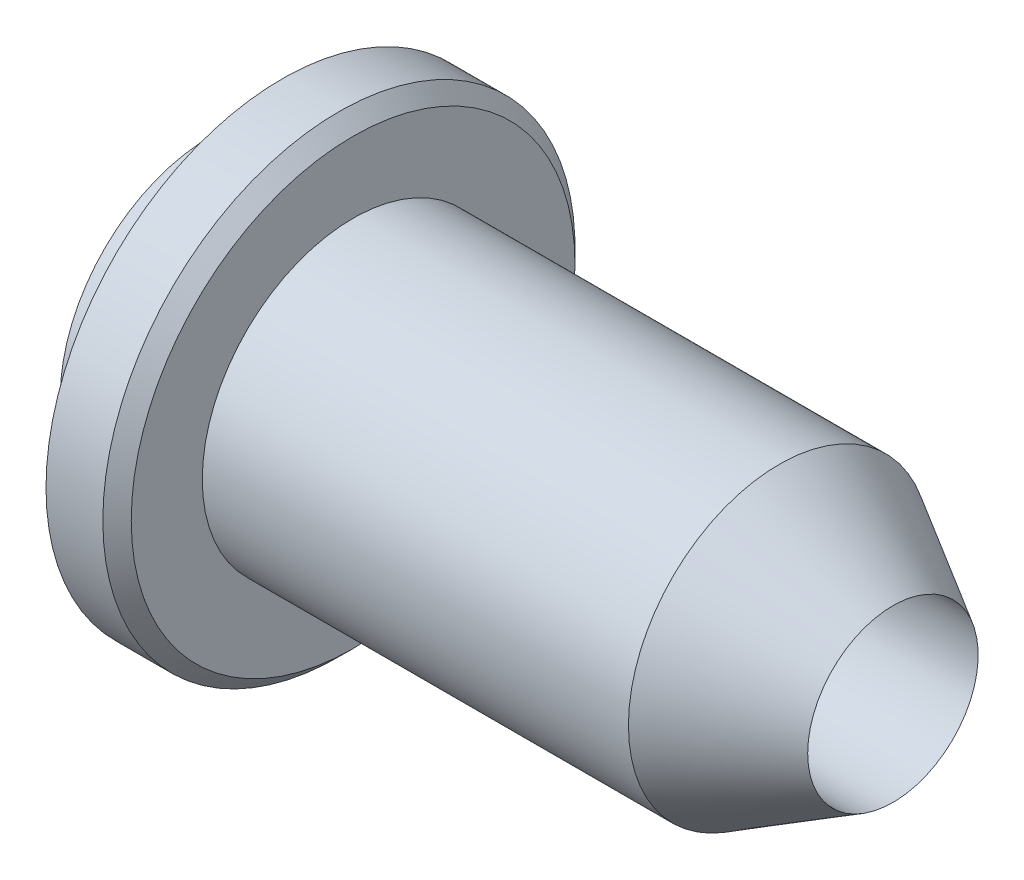
ISO-10303-21;
HEADER;
FILE_DESCRIPTION(('STEP AP214'),'2;1');
FILE_NAME('part.step','',(''),(''),'','','');
FILE_SCHEMA(('AUTOMOTIVE_DESIGN { 1 0 10303 214 1 1 1 1 }'));
ENDSEC;
DATA;
#1=APPLICATION_CONTEXT('core data for automotive mechanical design processes');
#2=APPLICATION_PROTOCOL_DEFINITION('international standard','automotive_design',2000,#1);
#3=PRODUCT_CONTEXT('',#1,'mechanical');
#4=PRODUCT('Part','Part','',(#3));
#5=PRODUCT_RELATED_PRODUCT_CATEGORY('part','',(#4));
#6=PRODUCT_DEFINITION_FORMATION('','',#4);
#7=PRODUCT_DEFINITION_CONTEXT('part definition',#1,'design');
#8=PRODUCT_DEFINITION('design','',#6,#7);
#9=PRODUCT_DEFINITION_SHAPE('','',#8);
#10=(LENGTH_UNIT() NAMED_UNIT(*) SI_UNIT(.MILLI.,.METRE.));
#11=(NAMED_UNIT(*) PLANE_ANGLE_UNIT() SI_UNIT($,.RADIAN.));
#12=(NAMED_UNIT(*) SI_UNIT($,.STERADIAN.) SOLID_ANGLE_UNIT());
#13=UNCERTAINTY_MEASURE_WITH_UNIT(LENGTH_MEASURE(1.E-05),#10,'distance_accuracy_value','');
#14=(GEOMETRIC_REPRESENTATION_CONTEXT(3) GLOBAL_UNCERTAINTY_ASSIGNED_CONTEXT((#13)) GLOBAL_UNIT_ASSIGNED_CONTEXT((#10,
#11,#12)) REPRESENTATION_CONTEXT('',''));
#15=CARTESIAN_POINT('',(0.,0.,0.));
#16=DIRECTION('',(0.,0.,1.));
#17=DIRECTION('',(1.,0.,0.));
#18=AXIS2_PLACEMENT_3D('',#15,#16,#17);
#19=CARTESIAN_POINT('',(10.,0.,0.));
#20=DIRECTION('',(-1.,0.,0.));
#21=DIRECTION('',(0.,0.,1.));
#22=AXIS2_PLACEMENT_3D('',#19,#20,#21);
#23=PLANE('',#22);
#24=CARTESIAN_POINT('',(10.,0.,0.));
#25=DIRECTION('',(-1.,0.,0.));
#26=DIRECTION('',(0.,0.,1.));
#27=AXIS2_PLACEMENT_3D('',#24,#25,#26);
#28=CIRCLE('',#27,15.618802153517);
#29=CARTESIAN_POINT('',(10.,0.,15.618802153517));
#30=VERTEX_POINT('',#29);
#31=EDGE_CURVE('E10',#30,#30,#28,.T.);
#32=ORIENTED_EDGE('',*,*,#31,.F.);
#33=EDGE_LOOP('',(#32));
#34=FACE_BOUND('',#33,.T.);
#35=CARTESIAN_POINT('',(10.,0.,0.));
#36=DIRECTION('',(-1.,0.,0.));
#37=DIRECTION('',(0.,0.,1.));
#38=AXIS2_PLACEMENT_3D('',#35,#36,#37);
#39=CIRCLE('',#38,10.618802153517);
#40=CARTESIAN_POINT('',(10.,0.,10.618802153517));
#41=VERTEX_POINT('',#40);
#42=EDGE_CURVE('E84',#41,#41,#39,.T.);
#43=ORIENTED_EDGE('',*,*,#42,.T.);
#44=EDGE_LOOP('',(#43));
#45=FACE_BOUND('',#44,.T.);
#46=ADVANCED_FACE('F45',(#34,#45),#23,.F.);
#47=CARTESIAN_POINT('',(10.,0.,0.));
#48=DIRECTION('',(-1.,0.,0.));
#49=DIRECTION('',(0.,0.,1.));
#50=AXIS2_PLACEMENT_3D('',#47,#48,#49);
#51=CONICAL_SURFACE('',#50,15.618802153517,0.78539816339745);
#52=CARTESIAN_POINT('',(9.00000000000001,0.,0.));
#53=DIRECTION('',(-1.,0.,0.));
#54=DIRECTION('',(0.,0.,1.));
#55=AXIS2_PLACEMENT_3D('',#52,#53,#54);
#56=CIRCLE('',#55,16.618802153517);
#57=CARTESIAN_POINT('',(9.00000000000001,0.,16.618802153517));
#58=VERTEX_POINT('',#57);
#59=EDGE_CURVE('E52',#58,#58,#56,.T.);
#60=ORIENTED_EDGE('',*,*,#59,.F.);
#61=EDGE_LOOP('',(#60));
#62=FACE_BOUND('',#61,.T.);
#63=ORIENTED_EDGE('',*,*,#31,.T.);
#64=EDGE_LOOP('',(#63));
#65=FACE_BOUND('',#64,.T.);
#66=ADVANCED_FACE('F113',(#62,#65),#51,.T.);
#67=CARTESIAN_POINT('',(0.,0.,0.));
#68=DIRECTION('',(-1.,0.,0.));
#69=DIRECTION('',(0.,0.,1.));
#70=AXIS2_PLACEMENT_3D('',#67,#68,#69);
#71=CYLINDRICAL_SURFACE('',#70,16.618802153517);
#72=CARTESIAN_POINT('',(5.,0.,0.));
#73=DIRECTION('',(-1.,0.,0.));
#74=DIRECTION('',(0.,0.,1.));
#75=AXIS2_PLACEMENT_3D('',#72,#73,#74);
#76=CIRCLE('',#75,16.618802153517);
#77=CARTESIAN_POINT('',(5.,0.,16.618802153517));
#78=VERTEX_POINT('',#77);
#79=EDGE_CURVE('E57',#78,#78,#76,.T.);
#80=ORIENTED_EDGE('',*,*,#79,.F.);
#81=EDGE_LOOP('',(#80));
#82=FACE_BOUND('',#81,.T.);
#83=ORIENTED_EDGE('',*,*,#59,.T.);
#84=EDGE_LOOP('',(#83));
#85=FACE_BOUND('',#84,.T.);
#86=ADVANCED_FACE('F117',(#82,#85),#71,.T.);
#87=CARTESIAN_POINT('',(5.,0.,0.));
#88=DIRECTION('',(-1.,0.,0.));
#89=DIRECTION('',(0.,0.,1.));
#90=AXIS2_PLACEMENT_3D('',#87,#88,#89);
#91=PLANE('',#90);
#92=ORIENTED_EDGE('',*,*,#79,.T.);
#93=EDGE_LOOP('',(#92));
#94=FACE_BOUND('',#93,.T.);
#95=CARTESIAN_POINT('',(5.,0.,0.));
#96=DIRECTION('',(-1.,0.,0.));
#97=DIRECTION('',(0.,0.,1.));
#98=AXIS2_PLACEMENT_3D('',#95,#96,#97);
#99=CIRCLE('',#98,10.618802153517);
#100=CARTESIAN_POINT('',(5.,0.,10.618802153517));
#101=VERTEX_POINT('',#100);
#102=EDGE_CURVE('E62',#101,#101,#99,.T.);
#103=ORIENTED_EDGE('',*,*,#102,.F.);
#104=EDGE_LOOP('',(#103));
#105=FACE_BOUND('',#104,.T.);
#106=ADVANCED_FACE('F121',(#94,#105),#91,.T.);
#107=CARTESIAN_POINT('',(0.,0.,0.));
#108=DIRECTION('',(-1.,0.,0.));
#109=DIRECTION('',(0.,0.,1.));
#110=AXIS2_PLACEMENT_3D('',#107,#108,#109);
#111=CYLINDRICAL_SURFACE('',#110,10.618802153517);
#112=CARTESIAN_POINT('',(0.,0.,0.));
#113=DIRECTION('',(-1.,0.,0.));
#114=DIRECTION('',(0.,0.,1.));
#115=AXIS2_PLACEMENT_3D('',#112,#113,#114);
#116=CIRCLE('',#115,10.618802153517);
#117=CARTESIAN_POINT('',(0.,0.,10.618802153517));
#118=VERTEX_POINT('',#117);
#119=EDGE_CURVE('E68',#118,#118,#116,.T.);
#120=ORIENTED_EDGE('',*,*,#119,.F.);
#121=EDGE_LOOP('',(#120));
#122=FACE_BOUND('',#121,.T.);
#123=ORIENTED_EDGE('',*,*,#102,.T.);
#124=EDGE_LOOP('',(#123));
#125=FACE_BOUND('',#124,.T.);
#126=ADVANCED_FACE('F109',(#122,#125),#111,.T.);
#127=CARTESIAN_POINT('',(0.,0.,0.));
#128=DIRECTION('',(1.,0.,0.));
#129=DIRECTION('',(0.,0.,-1.));
#130=AXIS2_PLACEMENT_3D('',#127,#128,#129);
#131=PLANE('',#130);
#132=CARTESIAN_POINT('',(0.,0.,0.));
#133=DIRECTION('',(-1.,0.,0.));
#134=DIRECTION('',(0.,0.,1.));
#135=AXIS2_PLACEMENT_3D('',#132,#133,#134);
#136=CIRCLE('',#135,5.99999999999999);
#137=CARTESIAN_POINT('',(0.,0.,5.99999999999999));
#138=VERTEX_POINT('',#137);
#139=EDGE_CURVE('E72',#138,#138,#136,.T.);
#140=ORIENTED_EDGE('',*,*,#139,.F.);
#141=EDGE_LOOP('',(#140));
#142=FACE_BOUND('',#141,.T.);
#143=ORIENTED_EDGE('',*,*,#119,.T.);
#144=EDGE_LOOP('',(#143));
#145=FACE_BOUND('',#144,.T.);
#146=ADVANCED_FACE('F104',(#142,#145),#131,.F.);
#147=CARTESIAN_POINT('',(0.,0.,0.));
#148=DIRECTION('',(-1.,0.,0.));
#149=DIRECTION('',(0.,0.,1.));
#150=AXIS2_PLACEMENT_3D('',#147,#148,#149);
#151=CYLINDRICAL_SURFACE('',#150,6.);
#152=ORIENTED_EDGE('',*,*,#139,.T.);
#153=EDGE_LOOP('',(#152));
#154=FACE_BOUND('',#153,.T.);
#155=CARTESIAN_POINT('',(48.,0.,0.));
#156=DIRECTION('',(-1.,0.,0.));
#157=DIRECTION('',(0.,0.,1.));
#158=AXIS2_PLACEMENT_3D('',#155,#156,#157);
#159=CIRCLE('',#158,6.);
#160=CARTESIAN_POINT('',(48.,0.,6.));
#161=VERTEX_POINT('',#160);
#162=EDGE_CURVE('E76',#161,#161,#159,.T.);
#163=ORIENTED_EDGE('',*,*,#162,.F.);
#164=EDGE_LOOP('',(#163));
#165=FACE_BOUND('',#164,.T.);
#166=ADVANCED_FACE('F99',(#154,#165),#151,.F.);
#167=CARTESIAN_POINT('',(48.,0.,0.));
#168=DIRECTION('',(-1.,0.,0.));
#169=DIRECTION('',(0.,0.,1.));
#170=AXIS2_PLACEMENT_3D('',#167,#168,#169);
#171=CONICAL_SURFACE('',#170,6.,0.523598775598301);
#172=CARTESIAN_POINT('',(40.,0.,0.));
#173=DIRECTION('',(-1.,0.,0.));
#174=DIRECTION('',(0.,0.,1.));
#175=AXIS2_PLACEMENT_3D('',#172,#173,#174);
#176=CIRCLE('',#175,10.618802153517);
#177=CARTESIAN_POINT('',(40.,0.,10.618802153517));
#178=VERTEX_POINT('',#177);
#179=EDGE_CURVE('E80',#178,#178,#176,.T.);
#180=ORIENTED_EDGE('',*,*,#179,.F.);
#181=EDGE_LOOP('',(#180));
#182=FACE_BOUND('',#181,.T.);
#183=ORIENTED_EDGE('',*,*,#162,.T.);
#184=EDGE_LOOP('',(#183));
#185=FACE_BOUND('',#184,.T.);
#186=ADVANCED_FACE('F93',(#182,#185),#171,.T.);
#187=CARTESIAN_POINT('',(0.,0.,0.));
#188=DIRECTION('',(-1.,0.,0.));
#189=DIRECTION('',(0.,0.,1.));
#190=AXIS2_PLACEMENT_3D('',#187,#188,#189);
#191=CYLINDRICAL_SURFACE('',#190,10.618802153517);
#192=ORIENTED_EDGE('',*,*,#42,.F.);
#193=EDGE_LOOP('',(#192));
#194=FACE_BOUND('',#193,.T.);
#195=ORIENTED_EDGE('',*,*,#179,.T.);
#196=EDGE_LOOP('',(#195));
#197=FACE_BOUND('',#196,.T.);
#198=ADVANCED_FACE('F90',(#194,#197),#191,.T.);
#199=CLOSED_SHELL('',(#46,#66,#86,#106,#126,#146,#166,#186,#198));
#200=MANIFOLD_SOLID_BREP('B2',#199);
#201=ADVANCED_BREP_SHAPE_REPRESENTATION('',(#18,#200),#14);
#202=SHAPE_DEFINITION_REPRESENTATION(#9,#201);
ENDSEC;
END-ISO-10303-21;
